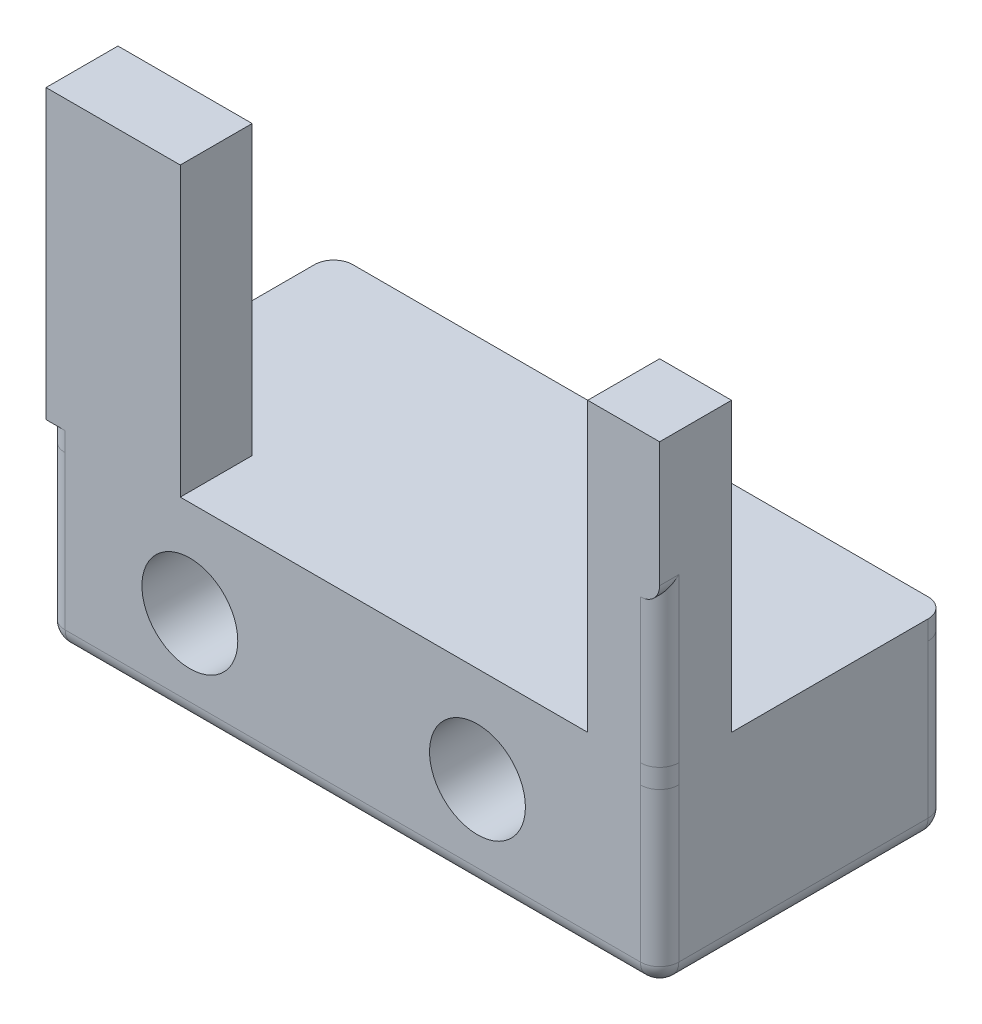
ISO-10303-21;
HEADER;
FILE_DESCRIPTION(('STEP AP214'),'2;1');
FILE_NAME('part.step','',(''),(''),'','','');
FILE_SCHEMA(('AUTOMOTIVE_DESIGN { 1 0 10303 214 1 1 1 1 }'));
ENDSEC;
DATA;
#1=APPLICATION_CONTEXT('core data for automotive mechanical design processes');
#2=APPLICATION_PROTOCOL_DEFINITION('international standard','automotive_design',2000,#1);
#3=PRODUCT_CONTEXT('',#1,'mechanical');
#4=PRODUCT('Part','Part','',(#3));
#5=PRODUCT_RELATED_PRODUCT_CATEGORY('part','',(#4));
#6=PRODUCT_DEFINITION_FORMATION('','',#4);
#7=PRODUCT_DEFINITION_CONTEXT('part definition',#1,'design');
#8=PRODUCT_DEFINITION('design','',#6,#7);
#9=PRODUCT_DEFINITION_SHAPE('','',#8);
#10=(LENGTH_UNIT() NAMED_UNIT(*) SI_UNIT(.MILLI.,.METRE.));
#11=(NAMED_UNIT(*) PLANE_ANGLE_UNIT() SI_UNIT($,.RADIAN.));
#12=(NAMED_UNIT(*) SI_UNIT($,.STERADIAN.) SOLID_ANGLE_UNIT());
#13=UNCERTAINTY_MEASURE_WITH_UNIT(LENGTH_MEASURE(1.E-05),#10,'distance_accuracy_value','');
#14=(GEOMETRIC_REPRESENTATION_CONTEXT(3) GLOBAL_UNCERTAINTY_ASSIGNED_CONTEXT((#13)) GLOBAL_UNIT_ASSIGNED_CONTEXT((#10,
#11,#12)) REPRESENTATION_CONTEXT('',''));
#15=CARTESIAN_POINT('',(0.,0.,0.));
#16=DIRECTION('',(0.,0.,1.));
#17=DIRECTION('',(1.,0.,0.));
#18=AXIS2_PLACEMENT_3D('',#15,#16,#17);
#19=CARTESIAN_POINT('',(62.,0.,28.));
#20=DIRECTION('',(0.,1.,0.));
#21=DIRECTION('',(-1.,0.,0.));
#22=AXIS2_PLACEMENT_3D('',#19,#20,#21);
#23=CYLINDRICAL_SURFACE('',#22,2.);
#24=DIRECTION('',(0.,1.,0.));
#25=VECTOR('',#24,1.);
#26=CARTESIAN_POINT('',(64.,0.,28.));
#27=LINE('',#26,#25);
#28=CARTESIAN_POINT('',(64.,18.,28.));
#29=VERTEX_POINT('',#28);
#30=CARTESIAN_POINT('',(64.,2.,28.));
#31=VERTEX_POINT('',#30);
#32=EDGE_CURVE('E323',#29,#31,#27,.F.);
#33=ORIENTED_EDGE('',*,*,#32,.F.);
#34=CARTESIAN_POINT('',(62.,18.,28.));
#35=DIRECTION('',(0.,1.,0.));
#36=DIRECTION('',(0.,0.,1.));
#37=AXIS2_PLACEMENT_3D('',#34,#35,#36);
#38=CIRCLE('',#37,2.);
#39=CARTESIAN_POINT('',(62.,18.,30.));
#40=VERTEX_POINT('',#39);
#41=EDGE_CURVE('E240',#29,#40,#38,.F.);
#42=ORIENTED_EDGE('',*,*,#41,.T.);
#43=DIRECTION('',(0.,1.,0.));
#44=VECTOR('',#43,1.);
#45=CARTESIAN_POINT('',(62.,0.,30.));
#46=LINE('',#45,#44);
#47=CARTESIAN_POINT('',(62.,2.,30.));
#48=VERTEX_POINT('',#47);
#49=EDGE_CURVE('E316',#48,#40,#46,.T.);
#50=ORIENTED_EDGE('',*,*,#49,.F.);
#51=CARTESIAN_POINT('',(62.,2.,28.));
#52=DIRECTION('',(0.,-1.,0.));
#53=DIRECTION('',(0.,0.,-1.));
#54=AXIS2_PLACEMENT_3D('',#51,#52,#53);
#55=CIRCLE('',#54,2.);
#56=EDGE_CURVE('E368',#31,#48,#55,.T.);
#57=ORIENTED_EDGE('',*,*,#56,.F.);
#58=EDGE_LOOP('',(#33,#42,#50,#57));
#59=FACE_BOUND('',#58,.T.);
#60=ADVANCED_FACE('F37',(#59),#23,.T.);
#61=CARTESIAN_POINT('',(2.,0.,28.));
#62=DIRECTION('',(0.,1.,0.));
#63=DIRECTION('',(0.,0.,1.));
#64=AXIS2_PLACEMENT_3D('',#61,#62,#63);
#65=CYLINDRICAL_SURFACE('',#64,2.);
#66=DIRECTION('',(0.,1.,0.));
#67=VECTOR('',#66,1.);
#68=CARTESIAN_POINT('',(2.,0.,30.));
#69=LINE('',#68,#67);
#70=CARTESIAN_POINT('',(2.,18.,30.));
#71=VERTEX_POINT('',#70);
#72=CARTESIAN_POINT('',(2.,2.,30.));
#73=VERTEX_POINT('',#72);
#74=EDGE_CURVE('E310',#71,#73,#69,.F.);
#75=ORIENTED_EDGE('',*,*,#74,.F.);
#76=CARTESIAN_POINT('',(2.,18.,28.));
#77=DIRECTION('',(0.,1.,0.));
#78=DIRECTION('',(0.,0.,1.));
#79=AXIS2_PLACEMENT_3D('',#76,#77,#78);
#80=CIRCLE('',#79,2.);
#81=CARTESIAN_POINT('',(0.,18.,28.));
#82=VERTEX_POINT('',#81);
#83=EDGE_CURVE('E238',#71,#82,#80,.F.);
#84=ORIENTED_EDGE('',*,*,#83,.T.);
#85=DIRECTION('',(0.,1.,0.));
#86=VECTOR('',#85,1.);
#87=CARTESIAN_POINT('',(0.,0.,28.));
#88=LINE('',#87,#86);
#89=CARTESIAN_POINT('',(0.,2.,28.));
#90=VERTEX_POINT('',#89);
#91=EDGE_CURVE('E302',#90,#82,#88,.T.);
#92=ORIENTED_EDGE('',*,*,#91,.F.);
#93=CARTESIAN_POINT('',(2.,2.,28.));
#94=DIRECTION('',(0.,-1.,0.));
#95=DIRECTION('',(0.,0.,-1.));
#96=AXIS2_PLACEMENT_3D('',#93,#94,#95);
#97=CIRCLE('',#96,2.);
#98=EDGE_CURVE('E348',#73,#90,#97,.T.);
#99=ORIENTED_EDGE('',*,*,#98,.F.);
#100=EDGE_LOOP('',(#75,#84,#92,#99));
#101=FACE_BOUND('',#100,.T.);
#102=ADVANCED_FACE('F404',(#101),#65,.T.);
#103=CARTESIAN_POINT('',(0.,50.,0.));
#104=DIRECTION('',(0.,-1.,0.));
#105=DIRECTION('',(0.,0.,-1.));
#106=AXIS2_PLACEMENT_3D('',#103,#104,#105);
#107=PLANE('',#106);
#108=DIRECTION('',(0.,0.,1.));
#109=VECTOR('',#108,1.);
#110=CARTESIAN_POINT('',(56.5,50.,-34.));
#111=LINE('',#110,#109);
#112=CARTESIAN_POINT('',(56.5,50.,22.5));
#113=VERTEX_POINT('',#112);
#114=CARTESIAN_POINT('',(56.5,50.,30.));
#115=VERTEX_POINT('',#114);
#116=EDGE_CURVE('E247',#113,#115,#111,.T.);
#117=ORIENTED_EDGE('',*,*,#116,.T.);
#118=DIRECTION('',(-1.,0.,0.));
#119=VECTOR('',#118,1.);
#120=CARTESIAN_POINT('',(64.,50.,30.));
#121=LINE('',#120,#119);
#122=CARTESIAN_POINT('',(64.,50.,30.));
#123=VERTEX_POINT('',#122);
#124=EDGE_CURVE('E258',#123,#115,#121,.T.);
#125=ORIENTED_EDGE('',*,*,#124,.F.);
#126=DIRECTION('',(0.,0.,1.));
#127=VECTOR('',#126,1.);
#128=CARTESIAN_POINT('',(64.,50.,17.));
#129=LINE('',#128,#127);
#130=CARTESIAN_POINT('',(64.,50.,22.5));
#131=VERTEX_POINT('',#130);
#132=EDGE_CURVE('E277',#131,#123,#129,.T.);
#133=ORIENTED_EDGE('',*,*,#132,.F.);
#134=DIRECTION('',(-1.,0.,0.));
#135=VECTOR('',#134,1.);
#136=CARTESIAN_POINT('',(64.,50.,22.5));
#137=LINE('',#136,#135);
#138=EDGE_CURVE('E263',#131,#113,#137,.T.);
#139=ORIENTED_EDGE('',*,*,#138,.T.);
#140=EDGE_LOOP('',(#117,#125,#133,#139));
#141=FACE_BOUND('',#140,.T.);
#142=ADVANCED_FACE('F454',(#141),#107,.F.);
#143=CARTESIAN_POINT('',(0.,0.,30.));
#144=DIRECTION('',(0.,0.,1.));
#145=DIRECTION('',(1.,0.,0.));
#146=AXIS2_PLACEMENT_3D('',#143,#144,#145);
#147=PLANE('',#146);
#148=DIRECTION('',(-1.,0.,0.));
#149=VECTOR('',#148,1.);
#150=CARTESIAN_POINT('',(14.,20.,30.));
#151=LINE('',#150,#149);
#152=CARTESIAN_POINT('',(2.,20.,30.));
#153=VERTEX_POINT('',#152);
#154=CARTESIAN_POINT('',(0.,20.,30.));
#155=VERTEX_POINT('',#154);
#156=EDGE_CURVE('E223',#153,#155,#151,.T.);
#157=ORIENTED_EDGE('',*,*,#156,.F.);
#158=DIRECTION('',(0.,1.,0.));
#159=VECTOR('',#158,1.);
#160=CARTESIAN_POINT('',(2.,0.,30.));
#161=LINE('',#160,#159);
#162=EDGE_CURVE('E45',#153,#71,#161,.F.);
#163=ORIENTED_EDGE('',*,*,#162,.T.);
#164=ORIENTED_EDGE('',*,*,#74,.T.);
#165=DIRECTION('',(1.,0.,0.));
#166=VECTOR('',#165,1.);
#167=CARTESIAN_POINT('',(64.,2.,30.));
#168=LINE('',#167,#166);
#169=EDGE_CURVE('E312',#73,#48,#168,.T.);
#170=ORIENTED_EDGE('',*,*,#169,.T.);
#171=ORIENTED_EDGE('',*,*,#49,.T.);
#172=DIRECTION('',(0.,1.,0.));
#173=VECTOR('',#172,1.);
#174=CARTESIAN_POINT('',(62.,0.,30.));
#175=LINE('',#174,#173);
#176=CARTESIAN_POINT('',(62.,20.,30.));
#177=VERTEX_POINT('',#176);
#178=EDGE_CURVE('E11',#40,#177,#175,.T.);
#179=ORIENTED_EDGE('',*,*,#178,.T.);
#180=CARTESIAN_POINT('',(62.,35.,30.));
#181=VERTEX_POINT('',#180);
#182=EDGE_CURVE('E315',#177,#181,#46,.T.);
#183=ORIENTED_EDGE('',*,*,#182,.T.);
#184=CARTESIAN_POINT('',(62.,37.,30.));
#185=DIRECTION('',(0.,0.,-1.));
#186=DIRECTION('',(-1.,0.,0.));
#187=AXIS2_PLACEMENT_3D('',#184,#185,#186);
#188=CIRCLE('',#187,2.);
#189=CARTESIAN_POINT('',(64.,37.,30.));
#190=VERTEX_POINT('',#189);
#191=EDGE_CURVE('E261',#181,#190,#188,.F.);
#192=ORIENTED_EDGE('',*,*,#191,.T.);
#193=DIRECTION('',(0.,-1.,0.));
#194=VECTOR('',#193,1.);
#195=CARTESIAN_POINT('',(64.,35.,30.));
#196=LINE('',#195,#194);
#197=EDGE_CURVE('E253',#123,#190,#196,.T.);
#198=ORIENTED_EDGE('',*,*,#197,.F.);
#199=ORIENTED_EDGE('',*,*,#124,.T.);
#200=DIRECTION('',(0.,-1.,0.));
#201=VECTOR('',#200,1.);
#202=CARTESIAN_POINT('',(56.5,0.,30.));
#203=LINE('',#202,#201);
#204=CARTESIAN_POINT('',(56.5,20.,30.));
#205=VERTEX_POINT('',#204);
#206=EDGE_CURVE('E242',#115,#205,#203,.T.);
#207=ORIENTED_EDGE('',*,*,#206,.T.);
#208=DIRECTION('',(-1.,0.,0.));
#209=VECTOR('',#208,1.);
#210=CARTESIAN_POINT('',(0.,20.,30.));
#211=LINE('',#210,#209);
#212=CARTESIAN_POINT('',(14.,20.,30.));
#213=VERTEX_POINT('',#212);
#214=EDGE_CURVE('E245',#205,#213,#211,.T.);
#215=ORIENTED_EDGE('',*,*,#214,.T.);
#216=DIRECTION('',(0.,1.,0.));
#217=VECTOR('',#216,1.);
#218=CARTESIAN_POINT('',(14.,20.,30.));
#219=LINE('',#218,#217);
#220=CARTESIAN_POINT('',(14.,50.,30.));
#221=VERTEX_POINT('',#220);
#222=EDGE_CURVE('E212',#213,#221,#219,.T.);
#223=ORIENTED_EDGE('',*,*,#222,.T.);
#224=CARTESIAN_POINT('',(0.,50.,30.));
#225=VERTEX_POINT('',#224);
#226=EDGE_CURVE('E256',#221,#225,#121,.T.);
#227=ORIENTED_EDGE('',*,*,#226,.T.);
#228=DIRECTION('',(0.,-1.,0.));
#229=VECTOR('',#228,1.);
#230=CARTESIAN_POINT('',(0.,35.,30.));
#231=LINE('',#230,#229);
#232=EDGE_CURVE('E250',#225,#155,#231,.T.);
#233=ORIENTED_EDGE('',*,*,#232,.T.);
#234=EDGE_LOOP('',(#157,#163,#164,#170,#171,#179,#183,#192,#198,#199,#207,#215,#223,#227,#233));
#235=FACE_BOUND('',#234,.T.);
#236=CARTESIAN_POINT('',(15.,10.,30.));
#237=DIRECTION('',(0.,0.,1.));
#238=DIRECTION('',(1.,0.,0.));
#239=AXIS2_PLACEMENT_3D('',#236,#237,#238);
#240=CIRCLE('',#239,5.);
#241=CARTESIAN_POINT('',(20.,10.,30.));
#242=VERTEX_POINT('',#241);
#243=EDGE_CURVE('E286',#242,#242,#240,.T.);
#244=ORIENTED_EDGE('',*,*,#243,.F.);
#245=EDGE_LOOP('',(#244));
#246=FACE_BOUND('',#245,.T.);
#247=CARTESIAN_POINT('',(45.,10.,30.));
#248=DIRECTION('',(0.,0.,1.));
#249=DIRECTION('',(1.,0.,0.));
#250=AXIS2_PLACEMENT_3D('',#247,#248,#249);
#251=CIRCLE('',#250,5.);
#252=CARTESIAN_POINT('',(50.,10.,30.));
#253=VERTEX_POINT('',#252);
#254=EDGE_CURVE('E281',#253,#253,#251,.T.);
#255=ORIENTED_EDGE('',*,*,#254,.F.);
#256=EDGE_LOOP('',(#255));
#257=FACE_BOUND('',#256,.T.);
#258=ADVANCED_FACE('F397',(#235,#246,#257),#147,.T.);
#259=CARTESIAN_POINT('',(64.,20.,22.5));
#260=DIRECTION('',(0.,0.,-1.));
#261=DIRECTION('',(-1.,0.,0.));
#262=AXIS2_PLACEMENT_3D('',#259,#260,#261);
#263=PLANE('',#262);
#264=DIRECTION('',(0.,1.,0.));
#265=VECTOR('',#264,1.);
#266=CARTESIAN_POINT('',(64.,20.,22.5));
#267=LINE('',#266,#265);
#268=CARTESIAN_POINT('',(64.,20.,22.5));
#269=VERTEX_POINT('',#268);
#270=EDGE_CURVE('E203',#269,#131,#267,.T.);
#271=ORIENTED_EDGE('',*,*,#270,.F.);
#272=DIRECTION('',(-1.,0.,0.));
#273=VECTOR('',#272,1.);
#274=CARTESIAN_POINT('',(64.,20.,22.5));
#275=LINE('',#274,#273);
#276=CARTESIAN_POINT('',(56.5,20.,22.5));
#277=VERTEX_POINT('',#276);
#278=EDGE_CURVE('E264',#269,#277,#275,.T.);
#279=ORIENTED_EDGE('',*,*,#278,.T.);
#280=DIRECTION('',(0.,1.,0.));
#281=VECTOR('',#280,1.);
#282=CARTESIAN_POINT('',(56.5,20.,22.5));
#283=LINE('',#282,#281);
#284=EDGE_CURVE('E336',#277,#113,#283,.T.);
#285=ORIENTED_EDGE('',*,*,#284,.T.);
#286=ORIENTED_EDGE('',*,*,#138,.F.);
#287=EDGE_LOOP('',(#271,#279,#285,#286));
#288=FACE_BOUND('',#287,.T.);
#289=ADVANCED_FACE('F495',(#288),#263,.T.);
#290=CARTESIAN_POINT('',(64.,0.,0.));
#291=DIRECTION('',(1.,0.,0.));
#292=DIRECTION('',(0.,1.,0.));
#293=AXIS2_PLACEMENT_3D('',#290,#291,#292);
#294=PLANE('',#293);
#295=DIRECTION('',(0.,1.,0.));
#296=VECTOR('',#295,1.);
#297=CARTESIAN_POINT('',(64.,20.,2.));
#298=LINE('',#297,#296);
#299=CARTESIAN_POINT('',(64.,2.,2.));
#300=VERTEX_POINT('',#299);
#301=CARTESIAN_POINT('',(64.,18.,2.));
#302=VERTEX_POINT('',#301);
#303=EDGE_CURVE('E319',#300,#302,#298,.T.);
#304=ORIENTED_EDGE('',*,*,#303,.T.);
#305=DIRECTION('',(0.,1.,0.));
#306=VECTOR('',#305,1.);
#307=CARTESIAN_POINT('',(64.,20.,2.));
#308=LINE('',#307,#306);
#309=CARTESIAN_POINT('',(64.,20.,2.));
#310=VERTEX_POINT('',#309);
#311=EDGE_CURVE('E392',#302,#310,#308,.T.);
#312=ORIENTED_EDGE('',*,*,#311,.T.);
#313=DIRECTION('',(0.,0.,-1.));
#314=VECTOR('',#313,1.);
#315=CARTESIAN_POINT('',(64.,20.,30.));
#316=LINE('',#315,#314);
#317=EDGE_CURVE('E230',#269,#310,#316,.T.);
#318=ORIENTED_EDGE('',*,*,#317,.F.);
#319=ORIENTED_EDGE('',*,*,#270,.T.);
#320=ORIENTED_EDGE('',*,*,#132,.T.);
#321=ORIENTED_EDGE('',*,*,#197,.T.);
#322=DIRECTION('',(0.,0.,-1.));
#323=VECTOR('',#322,1.);
#324=CARTESIAN_POINT('',(64.,37.,30.));
#325=LINE('',#324,#323);
#326=CARTESIAN_POINT('',(64.,37.,28.));
#327=VERTEX_POINT('',#326);
#328=EDGE_CURVE('E327',#190,#327,#325,.T.);
#329=ORIENTED_EDGE('',*,*,#328,.T.);
#330=CARTESIAN_POINT('',(64.,20.,28.));
#331=VERTEX_POINT('',#330);
#332=EDGE_CURVE('E324',#327,#331,#27,.F.);
#333=ORIENTED_EDGE('',*,*,#332,.T.);
#334=DIRECTION('',(0.,1.,0.));
#335=VECTOR('',#334,1.);
#336=CARTESIAN_POINT('',(64.,0.,28.));
#337=LINE('',#336,#335);
#338=EDGE_CURVE('E390',#331,#29,#337,.F.);
#339=ORIENTED_EDGE('',*,*,#338,.T.);
#340=ORIENTED_EDGE('',*,*,#32,.T.);
#341=DIRECTION('',(0.,0.,-1.));
#342=VECTOR('',#341,1.);
#343=CARTESIAN_POINT('',(64.,2.,0.));
#344=LINE('',#343,#342);
#345=EDGE_CURVE('E321',#31,#300,#344,.T.);
#346=ORIENTED_EDGE('',*,*,#345,.T.);
#347=EDGE_LOOP('',(#304,#312,#318,#319,#320,#321,#329,#333,#339,#340,#346));
#348=FACE_BOUND('',#347,.T.);
#349=ADVANCED_FACE('F477',(#348),#294,.T.);
#350=CARTESIAN_POINT('',(0.,18.,22.5));
#351=DIRECTION('',(0.,0.,1.));
#352=DIRECTION('',(1.,0.,0.));
#353=AXIS2_PLACEMENT_3D('',#350,#351,#352);
#354=PLANE('',#353);
#355=DIRECTION('',(1.,0.,0.));
#356=VECTOR('',#355,1.);
#357=CARTESIAN_POINT('',(12.9158865219325,20.,22.5));
#358=LINE('',#357,#356);
#359=CARTESIAN_POINT('',(0.,20.,22.5));
#360=VERTEX_POINT('',#359);
#361=CARTESIAN_POINT('',(14.,20.,22.5));
#362=VERTEX_POINT('',#361);
#363=EDGE_CURVE('E192',#360,#362,#358,.T.);
#364=ORIENTED_EDGE('',*,*,#363,.F.);
#365=DIRECTION('',(0.,1.,0.));
#366=VECTOR('',#365,1.);
#367=CARTESIAN_POINT('',(0.,0.,22.5));
#368=LINE('',#367,#366);
#369=CARTESIAN_POINT('',(0.,50.,22.5));
#370=VERTEX_POINT('',#369);
#371=EDGE_CURVE('E271',#360,#370,#368,.T.);
#372=ORIENTED_EDGE('',*,*,#371,.T.);
#373=DIRECTION('',(1.,0.,0.));
#374=VECTOR('',#373,1.);
#375=CARTESIAN_POINT('',(0.,50.,22.5));
#376=LINE('',#375,#374);
#377=CARTESIAN_POINT('',(14.,50.,22.5));
#378=VERTEX_POINT('',#377);
#379=EDGE_CURVE('E202',#370,#378,#376,.T.);
#380=ORIENTED_EDGE('',*,*,#379,.T.);
#381=DIRECTION('',(0.,-1.,0.));
#382=VECTOR('',#381,1.);
#383=CARTESIAN_POINT('',(14.,50.,22.5));
#384=LINE('',#383,#382);
#385=EDGE_CURVE('E209',#378,#362,#384,.T.);
#386=ORIENTED_EDGE('',*,*,#385,.T.);
#387=EDGE_LOOP('',(#364,#372,#380,#386));
#388=FACE_BOUND('',#387,.T.);
#389=ADVANCED_FACE('F214',(#388),#354,.F.);
#390=CARTESIAN_POINT('',(0.,20.,30.));
#391=DIRECTION('',(0.,1.,0.));
#392=DIRECTION('',(0.,0.,1.));
#393=AXIS2_PLACEMENT_3D('',#390,#391,#392);
#394=PLANE('',#393);
#395=ORIENTED_EDGE('',*,*,#363,.T.);
#396=DIRECTION('',(0.,0.,1.));
#397=VECTOR('',#396,1.);
#398=CARTESIAN_POINT('',(14.,20.,22.5));
#399=LINE('',#398,#397);
#400=EDGE_CURVE('E196',#362,#213,#399,.T.);
#401=ORIENTED_EDGE('',*,*,#400,.T.);
#402=ORIENTED_EDGE('',*,*,#214,.F.);
#403=DIRECTION('',(0.,0.,1.));
#404=VECTOR('',#403,1.);
#405=CARTESIAN_POINT('',(56.5,20.,-34.));
#406=LINE('',#405,#404);
#407=EDGE_CURVE('E248',#277,#205,#406,.T.);
#408=ORIENTED_EDGE('',*,*,#407,.F.);
#409=ORIENTED_EDGE('',*,*,#278,.F.);
#410=ORIENTED_EDGE('',*,*,#317,.T.);
#411=CARTESIAN_POINT('',(62.,20.,2.));
#412=DIRECTION('',(0.,1.,0.));
#413=DIRECTION('',(0.,0.,1.));
#414=AXIS2_PLACEMENT_3D('',#411,#412,#413);
#415=CIRCLE('',#414,2.);
#416=CARTESIAN_POINT('',(62.,20.,0.));
#417=VERTEX_POINT('',#416);
#418=EDGE_CURVE('E52',#310,#417,#415,.T.);
#419=ORIENTED_EDGE('',*,*,#418,.T.);
#420=DIRECTION('',(-1.,0.,0.));
#421=VECTOR('',#420,1.);
#422=CARTESIAN_POINT('',(64.,20.,0.));
#423=LINE('',#422,#421);
#424=CARTESIAN_POINT('',(2.,20.,0.));
#425=VERTEX_POINT('',#424);
#426=EDGE_CURVE('E227',#417,#425,#423,.T.);
#427=ORIENTED_EDGE('',*,*,#426,.T.);
#428=CARTESIAN_POINT('',(2.,20.,2.));
#429=DIRECTION('',(0.,1.,0.));
#430=DIRECTION('',(0.,0.,1.));
#431=AXIS2_PLACEMENT_3D('',#428,#429,#430);
#432=CIRCLE('',#431,2.);
#433=CARTESIAN_POINT('',(0.,20.,2.));
#434=VERTEX_POINT('',#433);
#435=EDGE_CURVE('E60',#425,#434,#432,.T.);
#436=ORIENTED_EDGE('',*,*,#435,.T.);
#437=DIRECTION('',(0.,0.,1.));
#438=VECTOR('',#437,1.);
#439=CARTESIAN_POINT('',(0.,20.,0.));
#440=LINE('',#439,#438);
#441=EDGE_CURVE('E198',#434,#360,#440,.T.);
#442=ORIENTED_EDGE('',*,*,#441,.T.);
#443=EDGE_LOOP('',(#395,#401,#402,#408,#409,#410,#419,#427,#436,#442));
#444=FACE_BOUND('',#443,.T.);
#445=ADVANCED_FACE('F194',(#444),#394,.T.);
#446=CARTESIAN_POINT('',(0.,0.,30.));
#447=DIRECTION('',(0.,1.,0.));
#448=DIRECTION('',(0.,0.,1.));
#449=AXIS2_PLACEMENT_3D('',#446,#447,#448);
#450=PLANE('',#449);
#451=DIRECTION('',(1.,0.,0.));
#452=VECTOR('',#451,1.);
#453=CARTESIAN_POINT('',(0.,0.,28.));
#454=LINE('',#453,#452);
#455=CARTESIAN_POINT('',(62.,0.,28.));
#456=VERTEX_POINT('',#455);
#457=CARTESIAN_POINT('',(2.,0.,28.));
#458=VERTEX_POINT('',#457);
#459=EDGE_CURVE('E297',#456,#458,#454,.F.);
#460=ORIENTED_EDGE('',*,*,#459,.T.);
#461=DIRECTION('',(0.,0.,-1.));
#462=VECTOR('',#461,1.);
#463=CARTESIAN_POINT('',(2.,0.,0.));
#464=LINE('',#463,#462);
#465=CARTESIAN_POINT('',(2.,0.,2.));
#466=VERTEX_POINT('',#465);
#467=EDGE_CURVE('E299',#458,#466,#464,.T.);
#468=ORIENTED_EDGE('',*,*,#467,.T.);
#469=DIRECTION('',(1.,0.,0.));
#470=VECTOR('',#469,1.);
#471=CARTESIAN_POINT('',(0.,0.,2.));
#472=LINE('',#471,#470);
#473=CARTESIAN_POINT('',(62.,0.,2.));
#474=VERTEX_POINT('',#473);
#475=EDGE_CURVE('E285',#466,#474,#472,.T.);
#476=ORIENTED_EDGE('',*,*,#475,.T.);
#477=DIRECTION('',(0.,0.,-1.));
#478=VECTOR('',#477,1.);
#479=CARTESIAN_POINT('',(62.,0.,30.));
#480=LINE('',#479,#478);
#481=EDGE_CURVE('E295',#474,#456,#480,.F.);
#482=ORIENTED_EDGE('',*,*,#481,.T.);
#483=EDGE_LOOP('',(#460,#468,#476,#482));
#484=FACE_BOUND('',#483,.T.);
#485=ADVANCED_FACE('F429',(#484),#450,.F.);
#486=CARTESIAN_POINT('',(0.,0.,30.));
#487=DIRECTION('',(-1.,0.,0.));
#488=DIRECTION('',(0.,0.,1.));
#489=AXIS2_PLACEMENT_3D('',#486,#487,#488);
#490=PLANE('',#489);
#491=DIRECTION('',(0.,1.,0.));
#492=VECTOR('',#491,1.);
#493=CARTESIAN_POINT('',(0.,0.,28.));
#494=LINE('',#493,#492);
#495=CARTESIAN_POINT('',(0.,20.,28.));
#496=VERTEX_POINT('',#495);
#497=EDGE_CURVE('E385',#82,#496,#494,.T.);
#498=ORIENTED_EDGE('',*,*,#497,.T.);
#499=DIRECTION('',(0.,0.,1.));
#500=VECTOR('',#499,1.);
#501=CARTESIAN_POINT('',(0.,20.,22.5));
#502=LINE('',#501,#500);
#503=EDGE_CURVE('E216',#496,#155,#502,.T.);
#504=ORIENTED_EDGE('',*,*,#503,.T.);
#505=ORIENTED_EDGE('',*,*,#232,.F.);
#506=DIRECTION('',(0.,0.,1.));
#507=VECTOR('',#506,1.);
#508=CARTESIAN_POINT('',(0.,50.,16.2144897973971));
#509=LINE('',#508,#507);
#510=EDGE_CURVE('E274',#370,#225,#509,.T.);
#511=ORIENTED_EDGE('',*,*,#510,.F.);
#512=ORIENTED_EDGE('',*,*,#371,.F.);
#513=ORIENTED_EDGE('',*,*,#441,.F.);
#514=DIRECTION('',(0.,1.,0.));
#515=VECTOR('',#514,1.);
#516=CARTESIAN_POINT('',(0.,18.,2.));
#517=LINE('',#516,#515);
#518=CARTESIAN_POINT('',(0.,18.,2.));
#519=VERTEX_POINT('',#518);
#520=EDGE_CURVE('E388',#434,#519,#517,.F.);
#521=ORIENTED_EDGE('',*,*,#520,.T.);
#522=DIRECTION('',(0.,1.,0.));
#523=VECTOR('',#522,1.);
#524=CARTESIAN_POINT('',(0.,0.,2.));
#525=LINE('',#524,#523);
#526=CARTESIAN_POINT('',(0.,2.,2.));
#527=VERTEX_POINT('',#526);
#528=EDGE_CURVE('E308',#519,#527,#525,.F.);
#529=ORIENTED_EDGE('',*,*,#528,.T.);
#530=DIRECTION('',(0.,0.,-1.));
#531=VECTOR('',#530,1.);
#532=CARTESIAN_POINT('',(0.,2.,30.));
#533=LINE('',#532,#531);
#534=EDGE_CURVE('E305',#527,#90,#533,.F.);
#535=ORIENTED_EDGE('',*,*,#534,.T.);
#536=ORIENTED_EDGE('',*,*,#91,.T.);
#537=EDGE_LOOP('',(#498,#504,#505,#511,#512,#513,#521,#529,#535,#536));
#538=FACE_BOUND('',#537,.T.);
#539=ADVANCED_FACE('F408',(#538),#490,.T.);
#540=CARTESIAN_POINT('',(0.,0.,0.));
#541=DIRECTION('',(0.,0.,1.));
#542=DIRECTION('',(1.,0.,0.));
#543=AXIS2_PLACEMENT_3D('',#540,#541,#542);
#544=PLANE('',#543);
#545=DIRECTION('',(0.,1.,0.));
#546=VECTOR('',#545,1.);
#547=CARTESIAN_POINT('',(2.,20.,0.));
#548=LINE('',#547,#546);
#549=CARTESIAN_POINT('',(2.,2.,0.));
#550=VERTEX_POINT('',#549);
#551=CARTESIAN_POINT('',(2.,18.,0.));
#552=VERTEX_POINT('',#551);
#553=EDGE_CURVE('E329',#550,#552,#548,.T.);
#554=ORIENTED_EDGE('',*,*,#553,.T.);
#555=DIRECTION('',(0.,1.,0.));
#556=VECTOR('',#555,1.);
#557=CARTESIAN_POINT('',(2.,20.,0.));
#558=LINE('',#557,#556);
#559=EDGE_CURVE('E380',#552,#425,#558,.T.);
#560=ORIENTED_EDGE('',*,*,#559,.T.);
#561=ORIENTED_EDGE('',*,*,#426,.F.);
#562=DIRECTION('',(0.,1.,0.));
#563=VECTOR('',#562,1.);
#564=CARTESIAN_POINT('',(62.,18.,0.));
#565=LINE('',#564,#563);
#566=CARTESIAN_POINT('',(62.,18.,0.));
#567=VERTEX_POINT('',#566);
#568=EDGE_CURVE('E378',#417,#567,#565,.F.);
#569=ORIENTED_EDGE('',*,*,#568,.T.);
#570=DIRECTION('',(0.,1.,0.));
#571=VECTOR('',#570,1.);
#572=CARTESIAN_POINT('',(62.,0.,0.));
#573=LINE('',#572,#571);
#574=CARTESIAN_POINT('',(62.,2.,0.));
#575=VERTEX_POINT('',#574);
#576=EDGE_CURVE('E331',#567,#575,#573,.F.);
#577=ORIENTED_EDGE('',*,*,#576,.T.);
#578=DIRECTION('',(1.,0.,0.));
#579=VECTOR('',#578,1.);
#580=CARTESIAN_POINT('',(0.,2.,0.));
#581=LINE('',#580,#579);
#582=EDGE_CURVE('E333',#575,#550,#581,.F.);
#583=ORIENTED_EDGE('',*,*,#582,.T.);
#584=EDGE_LOOP('',(#554,#560,#561,#569,#577,#583));
#585=FACE_BOUND('',#584,.T.);
#586=CARTESIAN_POINT('',(15.,10.,0.));
#587=DIRECTION('',(0.,0.,1.));
#588=DIRECTION('',(1.,0.,0.));
#589=AXIS2_PLACEMENT_3D('',#586,#587,#588);
#590=CIRCLE('',#589,5.);
#591=CARTESIAN_POINT('',(20.,10.,0.));
#592=VERTEX_POINT('',#591);
#593=EDGE_CURVE('E282',#592,#592,#590,.T.);
#594=ORIENTED_EDGE('',*,*,#593,.T.);
#595=EDGE_LOOP('',(#594));
#596=FACE_BOUND('',#595,.T.);
#597=CARTESIAN_POINT('',(45.,10.,0.));
#598=DIRECTION('',(0.,0.,1.));
#599=DIRECTION('',(1.,0.,0.));
#600=AXIS2_PLACEMENT_3D('',#597,#598,#599);
#601=CIRCLE('',#600,5.);
#602=CARTESIAN_POINT('',(50.,10.,0.));
#603=VERTEX_POINT('',#602);
#604=EDGE_CURVE('E289',#603,#603,#601,.T.);
#605=ORIENTED_EDGE('',*,*,#604,.T.);
#606=EDGE_LOOP('',(#605));
#607=FACE_BOUND('',#606,.T.);
#608=ADVANCED_FACE('F520',(#585,#596,#607),#544,.F.);
#609=CARTESIAN_POINT('',(45.,10.,0.));
#610=DIRECTION('',(0.,0.,1.));
#611=DIRECTION('',(1.,0.,0.));
#612=AXIS2_PLACEMENT_3D('',#609,#610,#611);
#613=CYLINDRICAL_SURFACE('',#612,5.);
#614=ORIENTED_EDGE('',*,*,#604,.F.);
#615=EDGE_LOOP('',(#614));
#616=FACE_BOUND('',#615,.T.);
#617=ORIENTED_EDGE('',*,*,#254,.T.);
#618=EDGE_LOOP('',(#617));
#619=FACE_BOUND('',#618,.T.);
#620=ADVANCED_FACE('F517',(#616,#619),#613,.F.);
#621=CARTESIAN_POINT('',(15.,10.,0.));
#622=DIRECTION('',(0.,0.,1.));
#623=DIRECTION('',(1.,0.,0.));
#624=AXIS2_PLACEMENT_3D('',#621,#622,#623);
#625=CYLINDRICAL_SURFACE('',#624,5.);
#626=ORIENTED_EDGE('',*,*,#593,.F.);
#627=EDGE_LOOP('',(#626));
#628=FACE_BOUND('',#627,.T.);
#629=ORIENTED_EDGE('',*,*,#243,.T.);
#630=EDGE_LOOP('',(#629));
#631=FACE_BOUND('',#630,.T.);
#632=ADVANCED_FACE('F512',(#628,#631),#625,.F.);
#633=CARTESIAN_POINT('',(0.,50.,0.));
#634=DIRECTION('',(0.,1.,0.));
#635=DIRECTION('',(0.,0.,1.));
#636=AXIS2_PLACEMENT_3D('',#633,#634,#635);
#637=PLANE('',#636);
#638=ORIENTED_EDGE('',*,*,#226,.F.);
#639=DIRECTION('',(0.,0.,-1.));
#640=VECTOR('',#639,1.);
#641=CARTESIAN_POINT('',(14.,50.,30.));
#642=LINE('',#641,#640);
#643=EDGE_CURVE('E222',#221,#378,#642,.T.);
#644=ORIENTED_EDGE('',*,*,#643,.T.);
#645=ORIENTED_EDGE('',*,*,#379,.F.);
#646=ORIENTED_EDGE('',*,*,#510,.T.);
#647=EDGE_LOOP('',(#638,#644,#645,#646));
#648=FACE_BOUND('',#647,.T.);
#649=ADVANCED_FACE('F469',(#648),#637,.T.);
#650=CARTESIAN_POINT('',(62.,37.,0.));
#651=DIRECTION('',(0.,0.,1.));
#652=DIRECTION('',(1.,0.,0.));
#653=AXIS2_PLACEMENT_3D('',#650,#651,#652);
#654=CYLINDRICAL_SURFACE('',#653,2.);
#655=ORIENTED_EDGE('',*,*,#191,.F.);
#656=CARTESIAN_POINT('',(62.,37.,28.));
#657=DIRECTION('',(0.,0.707106781186547,0.707106781186547));
#658=DIRECTION('',(0.,-0.707106781186547,0.707106781186547));
#659=AXIS2_PLACEMENT_3D('',#656,#657,#658);
#660=ELLIPSE('',#659,2.82842712474619,2.);
#661=EDGE_CURVE('E278',#327,#181,#660,.F.);
#662=ORIENTED_EDGE('',*,*,#661,.F.);
#663=ORIENTED_EDGE('',*,*,#328,.F.);
#664=EDGE_LOOP('',(#655,#662,#663));
#665=FACE_BOUND('',#664,.T.);
#666=ADVANCED_FACE('F461',(#665),#654,.T.);
#667=CARTESIAN_POINT('',(62.,20.,28.));
#668=DIRECTION('',(0.,1.,0.));
#669=DIRECTION('',(0.,0.,1.));
#670=AXIS2_PLACEMENT_3D('',#667,#668,#669);
#671=CIRCLE('',#670,2.);
#672=EDGE_CURVE('E236',#331,#177,#671,.F.);
#673=ORIENTED_EDGE('',*,*,#672,.F.);
#674=ORIENTED_EDGE('',*,*,#332,.F.);
#675=ORIENTED_EDGE('',*,*,#661,.T.);
#676=ORIENTED_EDGE('',*,*,#182,.F.);
#677=EDGE_LOOP('',(#673,#674,#675,#676));
#678=FACE_BOUND('',#677,.T.);
#679=ADVANCED_FACE('F450',(#678),#23,.T.);
#680=CARTESIAN_POINT('',(62.,2.,0.));
#681=DIRECTION('',(0.,0.,1.));
#682=DIRECTION('',(1.,0.,0.));
#683=AXIS2_PLACEMENT_3D('',#680,#681,#682);
#684=CYLINDRICAL_SURFACE('',#683,2.);
#685=CARTESIAN_POINT('',(62.,2.,2.));
#686=DIRECTION('',(0.,0.,-1.));
#687=DIRECTION('',(0.,1.,0.));
#688=AXIS2_PLACEMENT_3D('',#685,#686,#687);
#689=CIRCLE('',#688,2.);
#690=EDGE_CURVE('E362',#300,#474,#689,.T.);
#691=ORIENTED_EDGE('',*,*,#690,.F.);
#692=ORIENTED_EDGE('',*,*,#345,.F.);
#693=CARTESIAN_POINT('',(62.,2.,28.));
#694=DIRECTION('',(0.,0.,1.));
#695=DIRECTION('',(1.,0.,0.));
#696=AXIS2_PLACEMENT_3D('',#693,#694,#695);
#697=CIRCLE('',#696,2.);
#698=EDGE_CURVE('E365',#456,#31,#697,.T.);
#699=ORIENTED_EDGE('',*,*,#698,.F.);
#700=ORIENTED_EDGE('',*,*,#481,.F.);
#701=EDGE_LOOP('',(#691,#692,#699,#700));
#702=FACE_BOUND('',#701,.T.);
#703=ADVANCED_FACE('F460',(#702),#684,.T.);
#704=CARTESIAN_POINT('',(62.,0.,2.));
#705=DIRECTION('',(0.,-1.,0.));
#706=DIRECTION('',(1.,0.,0.));
#707=AXIS2_PLACEMENT_3D('',#704,#705,#706);
#708=CYLINDRICAL_SURFACE('',#707,2.);
#709=CARTESIAN_POINT('',(62.,18.,2.));
#710=DIRECTION('',(0.,1.,0.));
#711=DIRECTION('',(0.,0.,1.));
#712=AXIS2_PLACEMENT_3D('',#709,#710,#711);
#713=CIRCLE('',#712,2.);
#714=EDGE_CURVE('E371',#567,#302,#713,.F.);
#715=ORIENTED_EDGE('',*,*,#714,.T.);
#716=ORIENTED_EDGE('',*,*,#303,.F.);
#717=CARTESIAN_POINT('',(62.,2.,2.));
#718=DIRECTION('',(0.,-1.,0.));
#719=DIRECTION('',(0.,0.,-1.));
#720=AXIS2_PLACEMENT_3D('',#717,#718,#719);
#721=CIRCLE('',#720,2.);
#722=EDGE_CURVE('E359',#575,#300,#721,.T.);
#723=ORIENTED_EDGE('',*,*,#722,.F.);
#724=ORIENTED_EDGE('',*,*,#576,.F.);
#725=EDGE_LOOP('',(#715,#716,#723,#724));
#726=FACE_BOUND('',#725,.T.);
#727=ADVANCED_FACE('F467',(#726),#708,.T.);
#728=CARTESIAN_POINT('',(62.,2.,28.));
#729=DIRECTION('',(1.,0.,0.));
#730=DIRECTION('',(0.,0.,-1.));
#731=AXIS2_PLACEMENT_3D('',#728,#729,#730);
#732=SPHERICAL_SURFACE('',#731,2.);
#733=ORIENTED_EDGE('',*,*,#698,.T.);
#734=ORIENTED_EDGE('',*,*,#56,.T.);
#735=CARTESIAN_POINT('',(62.,2.,28.));
#736=DIRECTION('',(1.,0.,0.));
#737=DIRECTION('',(0.,0.,-1.));
#738=AXIS2_PLACEMENT_3D('',#735,#736,#737);
#739=CIRCLE('',#738,2.);
#740=EDGE_CURVE('E357',#456,#48,#739,.F.);
#741=ORIENTED_EDGE('',*,*,#740,.F.);
#742=EDGE_LOOP('',(#733,#734,#741));
#743=FACE_BOUND('',#742,.T.);
#744=ADVANCED_FACE('F655',(#743),#732,.T.);
#745=CARTESIAN_POINT('',(62.,2.,2.));
#746=DIRECTION('',(1.,0.,0.));
#747=DIRECTION('',(0.,0.,-1.));
#748=AXIS2_PLACEMENT_3D('',#745,#746,#747);
#749=SPHERICAL_SURFACE('',#748,2.);
#750=ORIENTED_EDGE('',*,*,#722,.T.);
#751=ORIENTED_EDGE('',*,*,#690,.T.);
#752=CARTESIAN_POINT('',(62.,2.,2.));
#753=DIRECTION('',(1.,0.,0.));
#754=DIRECTION('',(0.,0.,-1.));
#755=AXIS2_PLACEMENT_3D('',#752,#753,#754);
#756=CIRCLE('',#755,2.);
#757=EDGE_CURVE('E354',#575,#474,#756,.F.);
#758=ORIENTED_EDGE('',*,*,#757,.F.);
#759=EDGE_LOOP('',(#750,#751,#758));
#760=FACE_BOUND('',#759,.T.);
#761=ADVANCED_FACE('F679',(#760),#749,.T.);
#762=CARTESIAN_POINT('',(0.,2.,28.));
#763=DIRECTION('',(-1.,0.,0.));
#764=DIRECTION('',(0.,0.,1.));
#765=AXIS2_PLACEMENT_3D('',#762,#763,#764);
#766=CYLINDRICAL_SURFACE('',#765,2.);
#767=ORIENTED_EDGE('',*,*,#740,.T.);
#768=ORIENTED_EDGE('',*,*,#169,.F.);
#769=CARTESIAN_POINT('',(2.,2.,28.));
#770=DIRECTION('',(-1.,0.,0.));
#771=DIRECTION('',(0.,0.,1.));
#772=AXIS2_PLACEMENT_3D('',#769,#770,#771);
#773=CIRCLE('',#772,2.);
#774=EDGE_CURVE('E345',#458,#73,#773,.T.);
#775=ORIENTED_EDGE('',*,*,#774,.F.);
#776=ORIENTED_EDGE('',*,*,#459,.F.);
#777=EDGE_LOOP('',(#767,#768,#775,#776));
#778=FACE_BOUND('',#777,.T.);
#779=ADVANCED_FACE('F434',(#778),#766,.T.);
#780=CARTESIAN_POINT('',(0.,2.,2.));
#781=DIRECTION('',(1.,0.,0.));
#782=DIRECTION('',(0.,0.,-1.));
#783=AXIS2_PLACEMENT_3D('',#780,#781,#782);
#784=CYLINDRICAL_SURFACE('',#783,2.);
#785=ORIENTED_EDGE('',*,*,#757,.T.);
#786=ORIENTED_EDGE('',*,*,#475,.F.);
#787=CARTESIAN_POINT('',(2.,2.,2.));
#788=DIRECTION('',(-1.,0.,0.));
#789=DIRECTION('',(0.,0.,1.));
#790=AXIS2_PLACEMENT_3D('',#787,#788,#789);
#791=CIRCLE('',#790,2.);
#792=EDGE_CURVE('E342',#550,#466,#791,.T.);
#793=ORIENTED_EDGE('',*,*,#792,.F.);
#794=ORIENTED_EDGE('',*,*,#582,.F.);
#795=EDGE_LOOP('',(#785,#786,#793,#794));
#796=FACE_BOUND('',#795,.T.);
#797=ADVANCED_FACE('F425',(#796),#784,.T.);
#798=CARTESIAN_POINT('',(2.,0.,2.));
#799=DIRECTION('',(0.,-1.,0.));
#800=DIRECTION('',(0.,0.,-1.));
#801=AXIS2_PLACEMENT_3D('',#798,#799,#800);
#802=CYLINDRICAL_SURFACE('',#801,2.);
#803=CARTESIAN_POINT('',(2.,18.,2.));
#804=DIRECTION('',(0.,1.,0.));
#805=DIRECTION('',(0.,0.,1.));
#806=AXIS2_PLACEMENT_3D('',#803,#804,#805);
#807=CIRCLE('',#806,2.);
#808=EDGE_CURVE('E351',#519,#552,#807,.F.);
#809=ORIENTED_EDGE('',*,*,#808,.T.);
#810=ORIENTED_EDGE('',*,*,#553,.F.);
#811=CARTESIAN_POINT('',(2.,2.,2.));
#812=DIRECTION('',(0.,-1.,0.));
#813=DIRECTION('',(0.,0.,-1.));
#814=AXIS2_PLACEMENT_3D('',#811,#812,#813);
#815=CIRCLE('',#814,2.);
#816=EDGE_CURVE('E340',#527,#550,#815,.T.);
#817=ORIENTED_EDGE('',*,*,#816,.F.);
#818=ORIENTED_EDGE('',*,*,#528,.F.);
#819=EDGE_LOOP('',(#809,#810,#817,#818));
#820=FACE_BOUND('',#819,.T.);
#821=ADVANCED_FACE('F438',(#820),#802,.T.);
#822=CARTESIAN_POINT('',(2.,2.,28.));
#823=DIRECTION('',(0.,0.,1.));
#824=DIRECTION('',(1.,0.,0.));
#825=AXIS2_PLACEMENT_3D('',#822,#823,#824);
#826=SPHERICAL_SURFACE('',#825,2.);
#827=ORIENTED_EDGE('',*,*,#774,.T.);
#828=ORIENTED_EDGE('',*,*,#98,.T.);
#829=CARTESIAN_POINT('',(2.,2.,28.));
#830=DIRECTION('',(0.,0.,1.));
#831=DIRECTION('',(1.,0.,0.));
#832=AXIS2_PLACEMENT_3D('',#829,#830,#831);
#833=CIRCLE('',#832,2.);
#834=EDGE_CURVE('E338',#458,#90,#833,.F.);
#835=ORIENTED_EDGE('',*,*,#834,.F.);
#836=EDGE_LOOP('',(#827,#828,#835));
#837=FACE_BOUND('',#836,.T.);
#838=ADVANCED_FACE('F436',(#837),#826,.T.);
#839=CARTESIAN_POINT('',(2.,2.,2.));
#840=DIRECTION('',(0.,0.,-1.));
#841=DIRECTION('',(-1.,0.,0.));
#842=AXIS2_PLACEMENT_3D('',#839,#840,#841);
#843=SPHERICAL_SURFACE('',#842,2.);
#844=ORIENTED_EDGE('',*,*,#816,.T.);
#845=ORIENTED_EDGE('',*,*,#792,.T.);
#846=CARTESIAN_POINT('',(2.,2.,2.));
#847=DIRECTION('',(0.,0.,-1.));
#848=DIRECTION('',(-1.,0.,0.));
#849=AXIS2_PLACEMENT_3D('',#846,#847,#848);
#850=CIRCLE('',#849,2.);
#851=EDGE_CURVE('E273',#527,#466,#850,.F.);
#852=ORIENTED_EDGE('',*,*,#851,.F.);
#853=EDGE_LOOP('',(#844,#845,#852));
#854=FACE_BOUND('',#853,.T.);
#855=ADVANCED_FACE('F419',(#854),#843,.T.);
#856=CARTESIAN_POINT('',(2.,2.,30.));
#857=DIRECTION('',(0.,0.,1.));
#858=DIRECTION('',(1.,0.,0.));
#859=AXIS2_PLACEMENT_3D('',#856,#857,#858);
#860=CYLINDRICAL_SURFACE('',#859,2.);
#861=ORIENTED_EDGE('',*,*,#834,.T.);
#862=ORIENTED_EDGE('',*,*,#534,.F.);
#863=ORIENTED_EDGE('',*,*,#851,.T.);
#864=ORIENTED_EDGE('',*,*,#467,.F.);
#865=EDGE_LOOP('',(#861,#862,#863,#864));
#866=FACE_BOUND('',#865,.T.);
#867=ADVANCED_FACE('F415',(#866),#860,.T.);
#868=CARTESIAN_POINT('',(56.5,0.,-34.));
#869=DIRECTION('',(-1.,0.,0.));
#870=DIRECTION('',(0.,0.,1.));
#871=AXIS2_PLACEMENT_3D('',#868,#869,#870);
#872=PLANE('',#871);
#873=ORIENTED_EDGE('',*,*,#407,.T.);
#874=ORIENTED_EDGE('',*,*,#206,.F.);
#875=ORIENTED_EDGE('',*,*,#116,.F.);
#876=ORIENTED_EDGE('',*,*,#284,.F.);
#877=EDGE_LOOP('',(#873,#874,#875,#876));
#878=FACE_BOUND('',#877,.T.);
#879=ADVANCED_FACE('F492',(#878),#872,.T.);
#880=CARTESIAN_POINT('',(2.,0.,2.));
#881=DIRECTION('',(0.,-1.,0.));
#882=DIRECTION('',(0.,0.,-1.));
#883=AXIS2_PLACEMENT_3D('',#880,#881,#882);
#884=CYLINDRICAL_SURFACE('',#883,2.);
#885=ORIENTED_EDGE('',*,*,#808,.F.);
#886=ORIENTED_EDGE('',*,*,#520,.F.);
#887=ORIENTED_EDGE('',*,*,#435,.F.);
#888=ORIENTED_EDGE('',*,*,#559,.F.);
#889=EDGE_LOOP('',(#885,#886,#887,#888));
#890=FACE_BOUND('',#889,.T.);
#891=ADVANCED_FACE('F536',(#890),#884,.T.);
#892=CARTESIAN_POINT('',(62.,0.,2.));
#893=DIRECTION('',(0.,-1.,0.));
#894=DIRECTION('',(1.,0.,0.));
#895=AXIS2_PLACEMENT_3D('',#892,#893,#894);
#896=CYLINDRICAL_SURFACE('',#895,2.);
#897=ORIENTED_EDGE('',*,*,#714,.F.);
#898=ORIENTED_EDGE('',*,*,#568,.F.);
#899=ORIENTED_EDGE('',*,*,#418,.F.);
#900=ORIENTED_EDGE('',*,*,#311,.F.);
#901=EDGE_LOOP('',(#897,#898,#899,#900));
#902=FACE_BOUND('',#901,.T.);
#903=ADVANCED_FACE('F540',(#902),#896,.T.);
#904=CARTESIAN_POINT('',(62.,0.,28.));
#905=DIRECTION('',(0.,1.,0.));
#906=DIRECTION('',(-1.,0.,0.));
#907=AXIS2_PLACEMENT_3D('',#904,#905,#906);
#908=CYLINDRICAL_SURFACE('',#907,2.);
#909=ORIENTED_EDGE('',*,*,#41,.F.);
#910=ORIENTED_EDGE('',*,*,#338,.F.);
#911=ORIENTED_EDGE('',*,*,#672,.T.);
#912=ORIENTED_EDGE('',*,*,#178,.F.);
#913=EDGE_LOOP('',(#909,#910,#911,#912));
#914=FACE_BOUND('',#913,.T.);
#915=ADVANCED_FACE('F481',(#914),#908,.T.);
#916=CARTESIAN_POINT('',(2.,0.,28.));
#917=DIRECTION('',(0.,1.,0.));
#918=DIRECTION('',(0.,0.,1.));
#919=AXIS2_PLACEMENT_3D('',#916,#917,#918);
#920=CYLINDRICAL_SURFACE('',#919,2.);
#921=ORIENTED_EDGE('',*,*,#83,.F.);
#922=ORIENTED_EDGE('',*,*,#162,.F.);
#923=CARTESIAN_POINT('',(2.,20.,28.));
#924=DIRECTION('',(0.,1.,0.));
#925=DIRECTION('',(0.,0.,1.));
#926=AXIS2_PLACEMENT_3D('',#923,#924,#925);
#927=CIRCLE('',#926,2.);
#928=EDGE_CURVE('E233',#153,#496,#927,.F.);
#929=ORIENTED_EDGE('',*,*,#928,.T.);
#930=ORIENTED_EDGE('',*,*,#497,.F.);
#931=EDGE_LOOP('',(#921,#922,#929,#930));
#932=FACE_BOUND('',#931,.T.);
#933=ADVANCED_FACE('F39',(#932),#920,.T.);
#934=CARTESIAN_POINT('',(14.,20.,22.5));
#935=DIRECTION('',(0.,-1.,0.));
#936=DIRECTION('',(0.,0.,-1.));
#937=AXIS2_PLACEMENT_3D('',#934,#935,#936);
#938=PLANE('',#937);
#939=ORIENTED_EDGE('',*,*,#503,.F.);
#940=ORIENTED_EDGE('',*,*,#928,.F.);
#941=ORIENTED_EDGE('',*,*,#156,.T.);
#942=EDGE_LOOP('',(#939,#940,#941));
#943=FACE_BOUND('',#942,.T.);
#944=ADVANCED_FACE('F553',(#943),#938,.T.);
#945=CARTESIAN_POINT('',(14.,0.,0.));
#946=DIRECTION('',(-1.,0.,0.));
#947=DIRECTION('',(0.,0.,1.));
#948=AXIS2_PLACEMENT_3D('',#945,#946,#947);
#949=PLANE('',#948);
#950=ORIENTED_EDGE('',*,*,#385,.F.);
#951=ORIENTED_EDGE('',*,*,#643,.F.);
#952=ORIENTED_EDGE('',*,*,#222,.F.);
#953=ORIENTED_EDGE('',*,*,#400,.F.);
#954=EDGE_LOOP('',(#950,#951,#952,#953));
#955=FACE_BOUND('',#954,.T.);
#956=ADVANCED_FACE('F207',(#955),#949,.F.);
#957=CLOSED_SHELL('',(#60,#102,#142,#258,#289,#349,#389,#445,#485,#539,#608,#620,#632,#649,#666,
#679,#703,#727,#744,#761,#779,#797,#821,#838,#855,#867,#879,#891,#903,#915,#933,#944,#956));
#958=MANIFOLD_SOLID_BREP('B2',#957);
#959=ADVANCED_BREP_SHAPE_REPRESENTATION('',(#18,#958),#14);
#960=SHAPE_DEFINITION_REPRESENTATION(#9,#959);
ENDSEC;
END-ISO-10303-21;
